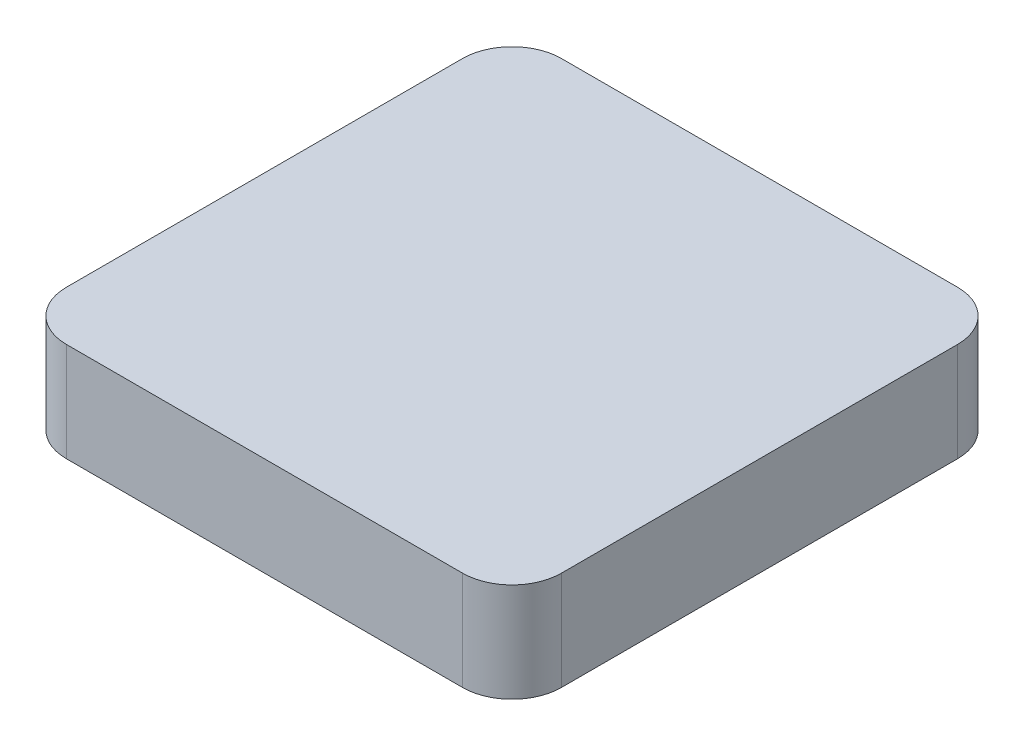
ISO-10303-21;
HEADER;
FILE_DESCRIPTION(('STEP AP214'),'2;1');
FILE_NAME('part.step','',(''),(''),'','','');
FILE_SCHEMA(('AUTOMOTIVE_DESIGN { 1 0 10303 214 1 1 1 1 }'));
ENDSEC;
DATA;
#1=APPLICATION_CONTEXT('core data for automotive mechanical design processes');
#2=APPLICATION_PROTOCOL_DEFINITION('international standard','automotive_design',2000,#1);
#3=PRODUCT_CONTEXT('',#1,'mechanical');
#4=PRODUCT('Part','Part','',(#3));
#5=PRODUCT_RELATED_PRODUCT_CATEGORY('part','',(#4));
#6=PRODUCT_DEFINITION_FORMATION('','',#4);
#7=PRODUCT_DEFINITION_CONTEXT('part definition',#1,'design');
#8=PRODUCT_DEFINITION('design','',#6,#7);
#9=PRODUCT_DEFINITION_SHAPE('','',#8);
#10=(LENGTH_UNIT() NAMED_UNIT(*) SI_UNIT(.MILLI.,.METRE.));
#11=(NAMED_UNIT(*) PLANE_ANGLE_UNIT() SI_UNIT($,.RADIAN.));
#12=(NAMED_UNIT(*) SI_UNIT($,.STERADIAN.) SOLID_ANGLE_UNIT());
#13=UNCERTAINTY_MEASURE_WITH_UNIT(LENGTH_MEASURE(1.E-05),#10,'distance_accuracy_value','');
#14=(GEOMETRIC_REPRESENTATION_CONTEXT(3) GLOBAL_UNCERTAINTY_ASSIGNED_CONTEXT((#13)) GLOBAL_UNIT_ASSIGNED_CONTEXT((#10,
#11,#12)) REPRESENTATION_CONTEXT('',''));
#15=CARTESIAN_POINT('',(0.,0.,0.));
#16=DIRECTION('',(0.,0.,1.));
#17=DIRECTION('',(1.,0.,0.));
#18=AXIS2_PLACEMENT_3D('',#15,#16,#17);
#19=CARTESIAN_POINT('',(-50.,20.,50.));
#20=DIRECTION('',(-1.,0.,0.));
#21=DIRECTION('',(0.,0.,1.));
#22=AXIS2_PLACEMENT_3D('',#19,#20,#21);
#23=PLANE('',#22);
#24=DIRECTION('',(0.,0.,-1.));
#25=VECTOR('',#24,1.);
#26=CARTESIAN_POINT('',(-50.,20.,50.));
#27=LINE('',#26,#25);
#28=CARTESIAN_POINT('',(-50.,20.,40.));
#29=VERTEX_POINT('',#28);
#30=CARTESIAN_POINT('',(-50.,20.,-40.));
#31=VERTEX_POINT('',#30);
#32=EDGE_CURVE('E165',#29,#31,#27,.T.);
#33=ORIENTED_EDGE('',*,*,#32,.T.);
#34=DIRECTION('',(0.,-1.,0.));
#35=VECTOR('',#34,1.);
#36=CARTESIAN_POINT('',(-50.,20.,-40.));
#37=LINE('',#36,#35);
#38=CARTESIAN_POINT('',(-50.,0.,-40.));
#39=VERTEX_POINT('',#38);
#40=EDGE_CURVE('E113',#31,#39,#37,.T.);
#41=ORIENTED_EDGE('',*,*,#40,.T.);
#42=DIRECTION('',(0.,0.,-1.));
#43=VECTOR('',#42,1.);
#44=CARTESIAN_POINT('',(-50.,0.,50.));
#45=LINE('',#44,#43);
#46=CARTESIAN_POINT('',(-50.,0.,40.));
#47=VERTEX_POINT('',#46);
#48=EDGE_CURVE('E105',#47,#39,#45,.T.);
#49=ORIENTED_EDGE('',*,*,#48,.F.);
#50=DIRECTION('',(0.,-1.,0.));
#51=VECTOR('',#50,1.);
#52=CARTESIAN_POINT('',(-50.,20.,40.));
#53=LINE('',#52,#51);
#54=EDGE_CURVE('E118',#47,#29,#53,.F.);
#55=ORIENTED_EDGE('',*,*,#54,.T.);
#56=EDGE_LOOP('',(#33,#41,#49,#55));
#57=FACE_BOUND('',#56,.T.);
#58=ADVANCED_FACE('F36',(#57),#23,.T.);
#59=CARTESIAN_POINT('',(-50.,20.,50.));
#60=DIRECTION('',(0.,0.,-1.));
#61=DIRECTION('',(-1.,0.,0.));
#62=AXIS2_PLACEMENT_3D('',#59,#60,#61);
#63=PLANE('',#62);
#64=DIRECTION('',(1.,0.,0.));
#65=VECTOR('',#64,1.);
#66=CARTESIAN_POINT('',(-50.,0.,50.));
#67=LINE('',#66,#65);
#68=CARTESIAN_POINT('',(-40.,0.,50.));
#69=VERTEX_POINT('',#68);
#70=CARTESIAN_POINT('',(40.,0.,50.));
#71=VERTEX_POINT('',#70);
#72=EDGE_CURVE('E107',#69,#71,#67,.T.);
#73=ORIENTED_EDGE('',*,*,#72,.T.);
#74=DIRECTION('',(0.,-1.,0.));
#75=VECTOR('',#74,1.);
#76=CARTESIAN_POINT('',(40.,20.,50.));
#77=LINE('',#76,#75);
#78=CARTESIAN_POINT('',(40.,20.,50.));
#79=VERTEX_POINT('',#78);
#80=EDGE_CURVE('E11',#71,#79,#77,.F.);
#81=ORIENTED_EDGE('',*,*,#80,.T.);
#82=DIRECTION('',(1.,0.,0.));
#83=VECTOR('',#82,1.);
#84=CARTESIAN_POINT('',(-50.,20.,50.));
#85=LINE('',#84,#83);
#86=CARTESIAN_POINT('',(-40.,20.,50.));
#87=VERTEX_POINT('',#86);
#88=EDGE_CURVE('E125',#87,#79,#85,.T.);
#89=ORIENTED_EDGE('',*,*,#88,.F.);
#90=DIRECTION('',(0.,-1.,0.));
#91=VECTOR('',#90,1.);
#92=CARTESIAN_POINT('',(-40.,0.,50.));
#93=LINE('',#92,#91);
#94=EDGE_CURVE('E44',#87,#69,#93,.T.);
#95=ORIENTED_EDGE('',*,*,#94,.T.);
#96=EDGE_LOOP('',(#73,#81,#89,#95));
#97=FACE_BOUND('',#96,.T.);
#98=ADVANCED_FACE('F154',(#97),#63,.F.);
#99=CARTESIAN_POINT('',(50.,20.,50.));
#100=DIRECTION('',(-1.,0.,0.));
#101=DIRECTION('',(0.,0.,1.));
#102=AXIS2_PLACEMENT_3D('',#99,#100,#101);
#103=PLANE('',#102);
#104=DIRECTION('',(0.,0.,-1.));
#105=VECTOR('',#104,1.);
#106=CARTESIAN_POINT('',(50.,0.,50.));
#107=LINE('',#106,#105);
#108=CARTESIAN_POINT('',(50.,0.,40.));
#109=VERTEX_POINT('',#108);
#110=CARTESIAN_POINT('',(50.,0.,-40.));
#111=VERTEX_POINT('',#110);
#112=EDGE_CURVE('E163',#109,#111,#107,.T.);
#113=ORIENTED_EDGE('',*,*,#112,.T.);
#114=DIRECTION('',(0.,-1.,0.));
#115=VECTOR('',#114,1.);
#116=CARTESIAN_POINT('',(50.,20.,-40.));
#117=LINE('',#116,#115);
#118=CARTESIAN_POINT('',(50.,20.,-40.));
#119=VERTEX_POINT('',#118);
#120=EDGE_CURVE('E51',#111,#119,#117,.F.);
#121=ORIENTED_EDGE('',*,*,#120,.T.);
#122=DIRECTION('',(0.,0.,-1.));
#123=VECTOR('',#122,1.);
#124=CARTESIAN_POINT('',(50.,20.,50.));
#125=LINE('',#124,#123);
#126=CARTESIAN_POINT('',(50.,20.,40.));
#127=VERTEX_POINT('',#126);
#128=EDGE_CURVE('E128',#127,#119,#125,.T.);
#129=ORIENTED_EDGE('',*,*,#128,.F.);
#130=DIRECTION('',(0.,-1.,0.));
#131=VECTOR('',#130,1.);
#132=CARTESIAN_POINT('',(50.,20.,40.));
#133=LINE('',#132,#131);
#134=EDGE_CURVE('E149',#127,#109,#133,.T.);
#135=ORIENTED_EDGE('',*,*,#134,.T.);
#136=EDGE_LOOP('',(#113,#121,#129,#135));
#137=FACE_BOUND('',#136,.T.);
#138=ADVANCED_FACE('F162',(#137),#103,.F.);
#139=CARTESIAN_POINT('',(-50.,20.,-50.));
#140=DIRECTION('',(0.,0.,-1.));
#141=DIRECTION('',(-1.,0.,0.));
#142=AXIS2_PLACEMENT_3D('',#139,#140,#141);
#143=PLANE('',#142);
#144=DIRECTION('',(1.,0.,0.));
#145=VECTOR('',#144,1.);
#146=CARTESIAN_POINT('',(-50.,0.,-50.));
#147=LINE('',#146,#145);
#148=CARTESIAN_POINT('',(-40.,0.,-50.));
#149=VERTEX_POINT('',#148);
#150=CARTESIAN_POINT('',(40.,0.,-50.));
#151=VERTEX_POINT('',#150);
#152=EDGE_CURVE('E121',#149,#151,#147,.T.);
#153=ORIENTED_EDGE('',*,*,#152,.F.);
#154=DIRECTION('',(0.,-1.,0.));
#155=VECTOR('',#154,1.);
#156=CARTESIAN_POINT('',(-40.,20.,-50.));
#157=LINE('',#156,#155);
#158=CARTESIAN_POINT('',(-40.,20.,-50.));
#159=VERTEX_POINT('',#158);
#160=EDGE_CURVE('E141',#149,#159,#157,.F.);
#161=ORIENTED_EDGE('',*,*,#160,.T.);
#162=DIRECTION('',(1.,0.,0.));
#163=VECTOR('',#162,1.);
#164=CARTESIAN_POINT('',(-50.,20.,-50.));
#165=LINE('',#164,#163);
#166=CARTESIAN_POINT('',(40.,20.,-50.));
#167=VERTEX_POINT('',#166);
#168=EDGE_CURVE('E169',#159,#167,#165,.T.);
#169=ORIENTED_EDGE('',*,*,#168,.T.);
#170=DIRECTION('',(0.,-1.,0.));
#171=VECTOR('',#170,1.);
#172=CARTESIAN_POINT('',(40.,0.,-50.));
#173=LINE('',#172,#171);
#174=EDGE_CURVE('E138',#167,#151,#173,.T.);
#175=ORIENTED_EDGE('',*,*,#174,.T.);
#176=EDGE_LOOP('',(#153,#161,#169,#175));
#177=FACE_BOUND('',#176,.T.);
#178=ADVANCED_FACE('F178',(#177),#143,.T.);
#179=CARTESIAN_POINT('',(0.,20.,0.));
#180=DIRECTION('',(0.,-1.,0.));
#181=DIRECTION('',(0.,0.,-1.));
#182=AXIS2_PLACEMENT_3D('',#179,#180,#181);
#183=PLANE('',#182);
#184=ORIENTED_EDGE('',*,*,#168,.F.);
#185=CARTESIAN_POINT('',(-40.,20.,-40.));
#186=DIRECTION('',(0.,-1.,0.));
#187=DIRECTION('',(0.,0.,-1.));
#188=AXIS2_PLACEMENT_3D('',#185,#186,#187);
#189=CIRCLE('',#188,10.);
#190=EDGE_CURVE('E147',#159,#31,#189,.F.);
#191=ORIENTED_EDGE('',*,*,#190,.T.);
#192=ORIENTED_EDGE('',*,*,#32,.F.);
#193=CARTESIAN_POINT('',(-40.,20.,40.));
#194=DIRECTION('',(0.,-1.,0.));
#195=DIRECTION('',(0.,0.,-1.));
#196=AXIS2_PLACEMENT_3D('',#193,#194,#195);
#197=CIRCLE('',#196,10.);
#198=EDGE_CURVE('E124',#29,#87,#197,.F.);
#199=ORIENTED_EDGE('',*,*,#198,.T.);
#200=ORIENTED_EDGE('',*,*,#88,.T.);
#201=CARTESIAN_POINT('',(40.,20.,40.));
#202=DIRECTION('',(0.,-1.,0.));
#203=DIRECTION('',(0.,0.,-1.));
#204=AXIS2_PLACEMENT_3D('',#201,#202,#203);
#205=CIRCLE('',#204,10.);
#206=EDGE_CURVE('E58',#79,#127,#205,.F.);
#207=ORIENTED_EDGE('',*,*,#206,.T.);
#208=ORIENTED_EDGE('',*,*,#128,.T.);
#209=CARTESIAN_POINT('',(40.,20.,-40.));
#210=DIRECTION('',(0.,-1.,0.));
#211=DIRECTION('',(0.,0.,-1.));
#212=AXIS2_PLACEMENT_3D('',#209,#210,#211);
#213=CIRCLE('',#212,10.);
#214=EDGE_CURVE('E145',#119,#167,#213,.F.);
#215=ORIENTED_EDGE('',*,*,#214,.T.);
#216=EDGE_LOOP('',(#184,#191,#192,#199,#200,#207,#208,#215));
#217=FACE_BOUND('',#216,.T.);
#218=ADVANCED_FACE('F157',(#217),#183,.F.);
#219=CARTESIAN_POINT('',(0.,0.,0.));
#220=DIRECTION('',(0.,-1.,0.));
#221=DIRECTION('',(0.,0.,-1.));
#222=AXIS2_PLACEMENT_3D('',#219,#220,#221);
#223=PLANE('',#222);
#224=ORIENTED_EDGE('',*,*,#48,.T.);
#225=CARTESIAN_POINT('',(-40.,0.,-40.));
#226=DIRECTION('',(0.,-1.,0.));
#227=DIRECTION('',(0.,0.,-1.));
#228=AXIS2_PLACEMENT_3D('',#225,#226,#227);
#229=CIRCLE('',#228,10.);
#230=EDGE_CURVE('E136',#39,#149,#229,.T.);
#231=ORIENTED_EDGE('',*,*,#230,.T.);
#232=ORIENTED_EDGE('',*,*,#152,.T.);
#233=CARTESIAN_POINT('',(40.,0.,-40.));
#234=DIRECTION('',(0.,-1.,0.));
#235=DIRECTION('',(0.,0.,-1.));
#236=AXIS2_PLACEMENT_3D('',#233,#234,#235);
#237=CIRCLE('',#236,10.);
#238=EDGE_CURVE('E134',#151,#111,#237,.T.);
#239=ORIENTED_EDGE('',*,*,#238,.T.);
#240=ORIENTED_EDGE('',*,*,#112,.F.);
#241=CARTESIAN_POINT('',(40.,0.,40.));
#242=DIRECTION('',(0.,-1.,0.));
#243=DIRECTION('',(0.,0.,-1.));
#244=AXIS2_PLACEMENT_3D('',#241,#242,#243);
#245=CIRCLE('',#244,10.);
#246=EDGE_CURVE('E112',#109,#71,#245,.T.);
#247=ORIENTED_EDGE('',*,*,#246,.T.);
#248=ORIENTED_EDGE('',*,*,#72,.F.);
#249=CARTESIAN_POINT('',(-40.,0.,40.));
#250=DIRECTION('',(0.,-1.,0.));
#251=DIRECTION('',(0.,0.,-1.));
#252=AXIS2_PLACEMENT_3D('',#249,#250,#251);
#253=CIRCLE('',#252,10.);
#254=EDGE_CURVE('E102',#69,#47,#253,.T.);
#255=ORIENTED_EDGE('',*,*,#254,.T.);
#256=EDGE_LOOP('',(#224,#231,#232,#239,#240,#247,#248,#255));
#257=FACE_BOUND('',#256,.T.);
#258=ADVANCED_FACE('F104',(#257),#223,.T.);
#259=CARTESIAN_POINT('',(-40.,20.,-40.));
#260=DIRECTION('',(0.,-1.,0.));
#261=DIRECTION('',(0.,0.,-1.));
#262=AXIS2_PLACEMENT_3D('',#259,#260,#261);
#263=CYLINDRICAL_SURFACE('',#262,10.);
#264=ORIENTED_EDGE('',*,*,#190,.F.);
#265=ORIENTED_EDGE('',*,*,#160,.F.);
#266=ORIENTED_EDGE('',*,*,#230,.F.);
#267=ORIENTED_EDGE('',*,*,#40,.F.);
#268=EDGE_LOOP('',(#264,#265,#266,#267));
#269=FACE_BOUND('',#268,.T.);
#270=ADVANCED_FACE('F174',(#269),#263,.T.);
#271=CARTESIAN_POINT('',(40.,20.,-40.));
#272=DIRECTION('',(0.,1.,0.));
#273=DIRECTION('',(0.,0.,1.));
#274=AXIS2_PLACEMENT_3D('',#271,#272,#273);
#275=CYLINDRICAL_SURFACE('',#274,10.);
#276=ORIENTED_EDGE('',*,*,#214,.F.);
#277=ORIENTED_EDGE('',*,*,#120,.F.);
#278=ORIENTED_EDGE('',*,*,#238,.F.);
#279=ORIENTED_EDGE('',*,*,#174,.F.);
#280=EDGE_LOOP('',(#276,#277,#278,#279));
#281=FACE_BOUND('',#280,.T.);
#282=ADVANCED_FACE('F182',(#281),#275,.T.);
#283=CARTESIAN_POINT('',(40.,20.,40.));
#284=DIRECTION('',(0.,-1.,0.));
#285=DIRECTION('',(0.,0.,-1.));
#286=AXIS2_PLACEMENT_3D('',#283,#284,#285);
#287=CYLINDRICAL_SURFACE('',#286,10.);
#288=ORIENTED_EDGE('',*,*,#206,.F.);
#289=ORIENTED_EDGE('',*,*,#80,.F.);
#290=ORIENTED_EDGE('',*,*,#246,.F.);
#291=ORIENTED_EDGE('',*,*,#134,.F.);
#292=EDGE_LOOP('',(#288,#289,#290,#291));
#293=FACE_BOUND('',#292,.T.);
#294=ADVANCED_FACE('F160',(#293),#287,.T.);
#295=CARTESIAN_POINT('',(-40.,20.,40.));
#296=DIRECTION('',(0.,1.,0.));
#297=DIRECTION('',(0.,0.,1.));
#298=AXIS2_PLACEMENT_3D('',#295,#296,#297);
#299=CYLINDRICAL_SURFACE('',#298,10.);
#300=ORIENTED_EDGE('',*,*,#198,.F.);
#301=ORIENTED_EDGE('',*,*,#54,.F.);
#302=ORIENTED_EDGE('',*,*,#254,.F.);
#303=ORIENTED_EDGE('',*,*,#94,.F.);
#304=EDGE_LOOP('',(#300,#301,#302,#303));
#305=FACE_BOUND('',#304,.T.);
#306=ADVANCED_FACE('F38',(#305),#299,.T.);
#307=CLOSED_SHELL('',(#58,#98,#138,#178,#218,#258,#270,#282,#294,#306));
#308=MANIFOLD_SOLID_BREP('B2',#307);
#309=ADVANCED_BREP_SHAPE_REPRESENTATION('',(#18,#308),#14);
#310=SHAPE_DEFINITION_REPRESENTATION(#9,#309);
ENDSEC;
END-ISO-10303-21;
